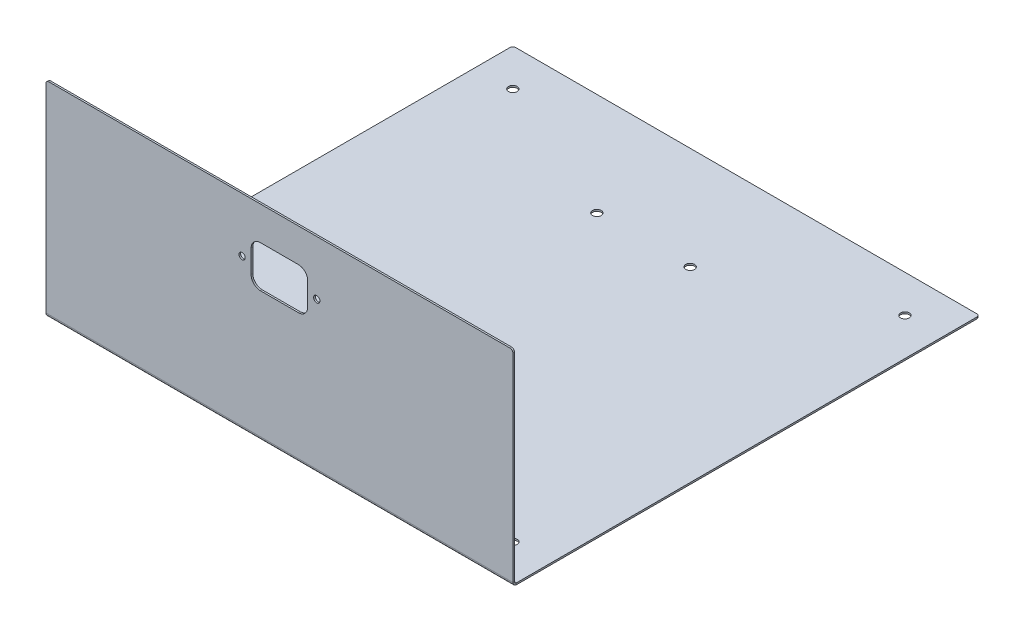
ISO-10303-21;
HEADER;
FILE_DESCRIPTION(('STEP AP214'),'2;1');
FILE_NAME('part.step','',(''),(''),'','','');
FILE_SCHEMA(('AUTOMOTIVE_DESIGN { 1 0 10303 214 1 1 1 1 }'));
ENDSEC;
DATA;
#1=APPLICATION_CONTEXT('core data for automotive mechanical design processes');
#2=APPLICATION_PROTOCOL_DEFINITION('international standard','automotive_design',2000,#1);
#3=PRODUCT_CONTEXT('',#1,'mechanical');
#4=PRODUCT('Part','Part','',(#3));
#5=PRODUCT_RELATED_PRODUCT_CATEGORY('part','',(#4));
#6=PRODUCT_DEFINITION_FORMATION('','',#4);
#7=PRODUCT_DEFINITION_CONTEXT('part definition',#1,'design');
#8=PRODUCT_DEFINITION('design','',#6,#7);
#9=PRODUCT_DEFINITION_SHAPE('','',#8);
#10=(LENGTH_UNIT() NAMED_UNIT(*) SI_UNIT(.MILLI.,.METRE.));
#11=(NAMED_UNIT(*) PLANE_ANGLE_UNIT() SI_UNIT($,.RADIAN.));
#12=(NAMED_UNIT(*) SI_UNIT($,.STERADIAN.) SOLID_ANGLE_UNIT());
#13=UNCERTAINTY_MEASURE_WITH_UNIT(LENGTH_MEASURE(1.E-05),#10,'distance_accuracy_value','');
#14=(GEOMETRIC_REPRESENTATION_CONTEXT(3) GLOBAL_UNCERTAINTY_ASSIGNED_CONTEXT((#13)) GLOBAL_UNIT_ASSIGNED_CONTEXT((#10,
#11,#12)) REPRESENTATION_CONTEXT('',''));
#15=CARTESIAN_POINT('',(0.,0.,0.));
#16=DIRECTION('',(0.,0.,1.));
#17=DIRECTION('',(1.,0.,0.));
#18=AXIS2_PLACEMENT_3D('',#15,#16,#17);
#19=CARTESIAN_POINT('',(125.,109.086699214334,70.8836992143335));
#20=DIRECTION('',(1.,0.,0.));
#21=DIRECTION('',(0.,-1.,0.));
#22=AXIS2_PLACEMENT_3D('',#19,#20,#21);
#23=PLANE('',#22);
#24=DIRECTION('',(0.,-1.,0.));
#25=VECTOR('',#24,1.);
#26=CARTESIAN_POINT('',(125.,109.086699214334,69.9736992143335));
#27=LINE('',#26,#25);
#28=CARTESIAN_POINT('',(125.,107.586699214334,69.9736992143335));
#29=VERTEX_POINT('',#28);
#30=CARTESIAN_POINT('',(125.,1.14300000000001,69.9736992143339));
#31=VERTEX_POINT('',#30);
#32=EDGE_CURVE('E236',#29,#31,#27,.T.);
#33=ORIENTED_EDGE('',*,*,#32,.F.);
#34=DIRECTION('',(0.,0.,-1.));
#35=VECTOR('',#34,1.);
#36=CARTESIAN_POINT('',(125.,107.586699214334,70.8836992143335));
#37=LINE('',#36,#35);
#38=CARTESIAN_POINT('',(125.,107.586699214334,70.8836992143335));
#39=VERTEX_POINT('',#38);
#40=EDGE_CURVE('E271',#29,#39,#37,.F.);
#41=ORIENTED_EDGE('',*,*,#40,.T.);
#42=DIRECTION('',(0.,-1.,0.));
#43=VECTOR('',#42,1.);
#44=CARTESIAN_POINT('',(125.,109.086699214334,70.8836992143335));
#45=LINE('',#44,#43);
#46=CARTESIAN_POINT('',(125.,1.14300000000001,70.8836992143339));
#47=VERTEX_POINT('',#46);
#48=EDGE_CURVE('E217',#39,#47,#45,.T.);
#49=ORIENTED_EDGE('',*,*,#48,.T.);
#50=DIRECTION('',(0.,0.,-1.));
#51=VECTOR('',#50,1.);
#52=CARTESIAN_POINT('',(125.,1.14300000000001,70.8836992143339));
#53=LINE('',#52,#51);
#54=EDGE_CURVE('E227',#47,#31,#53,.T.);
#55=ORIENTED_EDGE('',*,*,#54,.T.);
#56=EDGE_LOOP('',(#33,#41,#49,#55));
#57=FACE_BOUND('',#56,.T.);
#58=ADVANCED_FACE('F45',(#57),#23,.T.);
#59=CARTESIAN_POINT('',(-125.,109.086699214334,70.8836992143335));
#60=DIRECTION('',(-1.,0.,0.));
#61=DIRECTION('',(0.,1.,0.));
#62=AXIS2_PLACEMENT_3D('',#59,#60,#61);
#63=PLANE('',#62);
#64=DIRECTION('',(0.,1.,0.));
#65=VECTOR('',#64,1.);
#66=CARTESIAN_POINT('',(-125.,109.086699214334,70.8836992143335));
#67=LINE('',#66,#65);
#68=CARTESIAN_POINT('',(-125.,1.14300000000002,70.8836992143338));
#69=VERTEX_POINT('',#68);
#70=CARTESIAN_POINT('',(-125.,107.586699214334,70.8836992143335));
#71=VERTEX_POINT('',#70);
#72=EDGE_CURVE('E209',#69,#71,#67,.T.);
#73=ORIENTED_EDGE('',*,*,#72,.T.);
#74=DIRECTION('',(0.,0.,-1.));
#75=VECTOR('',#74,1.);
#76=CARTESIAN_POINT('',(-125.,107.586699214334,70.8836992143335));
#77=LINE('',#76,#75);
#78=CARTESIAN_POINT('',(-125.,107.586699214334,69.9736992143335));
#79=VERTEX_POINT('',#78);
#80=EDGE_CURVE('E257',#71,#79,#77,.T.);
#81=ORIENTED_EDGE('',*,*,#80,.T.);
#82=DIRECTION('',(0.,1.,0.));
#83=VECTOR('',#82,1.);
#84=CARTESIAN_POINT('',(-125.,109.086699214334,69.9736992143335));
#85=LINE('',#84,#83);
#86=CARTESIAN_POINT('',(-125.,1.14300000000001,69.9736992143339));
#87=VERTEX_POINT('',#86);
#88=EDGE_CURVE('E222',#87,#79,#85,.T.);
#89=ORIENTED_EDGE('',*,*,#88,.F.);
#90=DIRECTION('',(0.,0.,1.));
#91=VECTOR('',#90,1.);
#92=CARTESIAN_POINT('',(-125.,1.14300000000001,70.8836992143339));
#93=LINE('',#92,#91);
#94=EDGE_CURVE('E195',#87,#69,#93,.T.);
#95=ORIENTED_EDGE('',*,*,#94,.T.);
#96=EDGE_LOOP('',(#73,#81,#89,#95));
#97=FACE_BOUND('',#96,.T.);
#98=ADVANCED_FACE('F220',(#97),#63,.T.);
#99=CARTESIAN_POINT('',(0.,-70.0263007856661,70.8836992143341));
#100=DIRECTION('',(0.,0.,1.));
#101=DIRECTION('',(0.,-1.,0.));
#102=AXIS2_PLACEMENT_3D('',#99,#100,#101);
#103=PLANE('',#102);
#104=CARTESIAN_POINT('',(20.,80.,70.8836992143339));
#105=DIRECTION('',(0.,0.,1.));
#106=DIRECTION('',(1.,0.,0.));
#107=AXIS2_PLACEMENT_3D('',#104,#105,#106);
#108=CIRCLE('',#107,1.7);
#109=CARTESIAN_POINT('',(21.7,80.,70.8836992143339));
#110=VERTEX_POINT('',#109);
#111=EDGE_CURVE('E541',#110,#110,#108,.T.);
#112=ORIENTED_EDGE('',*,*,#111,.F.);
#113=EDGE_LOOP('',(#112));
#114=FACE_BOUND('',#113,.T.);
#115=CARTESIAN_POINT('',(-20.,80.,70.8836992143339));
#116=DIRECTION('',(0.,0.,1.));
#117=DIRECTION('',(1.,0.,0.));
#118=AXIS2_PLACEMENT_3D('',#115,#116,#117);
#119=CIRCLE('',#118,1.7);
#120=CARTESIAN_POINT('',(-18.3,80.,70.8836992143339));
#121=VERTEX_POINT('',#120);
#122=EDGE_CURVE('E362',#121,#121,#119,.T.);
#123=ORIENTED_EDGE('',*,*,#122,.F.);
#124=EDGE_LOOP('',(#123));
#125=FACE_BOUND('',#124,.T.);
#126=DIRECTION('',(0.,1.,0.));
#127=VECTOR('',#126,1.);
#128=CARTESIAN_POINT('',(15.15,68.85,70.8836992143339));
#129=LINE('',#128,#127);
#130=CARTESIAN_POINT('',(15.15,73.85,70.8836992143339));
#131=VERTEX_POINT('',#130);
#132=CARTESIAN_POINT('',(15.15,86.15,70.8836992143339));
#133=VERTEX_POINT('',#132);
#134=EDGE_CURVE('E349',#131,#133,#129,.T.);
#135=ORIENTED_EDGE('',*,*,#134,.F.);
#136=CARTESIAN_POINT('',(10.15,73.85,70.8836992143336));
#137=DIRECTION('',(0.,0.,1.));
#138=DIRECTION('',(0.,-1.,0.));
#139=AXIS2_PLACEMENT_3D('',#136,#137,#138);
#140=CIRCLE('',#139,5.);
#141=CARTESIAN_POINT('',(10.15,68.85,70.8836992143339));
#142=VERTEX_POINT('',#141);
#143=EDGE_CURVE('E310',#131,#142,#140,.F.);
#144=ORIENTED_EDGE('',*,*,#143,.T.);
#145=DIRECTION('',(1.,0.,0.));
#146=VECTOR('',#145,1.);
#147=CARTESIAN_POINT('',(-15.15,68.85,70.8836992143339));
#148=LINE('',#147,#146);
#149=CARTESIAN_POINT('',(-10.15,68.85,70.8836992143339));
#150=VERTEX_POINT('',#149);
#151=EDGE_CURVE('E288',#150,#142,#148,.T.);
#152=ORIENTED_EDGE('',*,*,#151,.F.);
#153=CARTESIAN_POINT('',(-10.15,73.85,70.8836992143336));
#154=DIRECTION('',(0.,0.,1.));
#155=DIRECTION('',(0.,-1.,0.));
#156=AXIS2_PLACEMENT_3D('',#153,#154,#155);
#157=CIRCLE('',#156,5.);
#158=CARTESIAN_POINT('',(-15.15,73.85,70.8836992143339));
#159=VERTEX_POINT('',#158);
#160=EDGE_CURVE('E53',#150,#159,#157,.F.);
#161=ORIENTED_EDGE('',*,*,#160,.T.);
#162=DIRECTION('',(0.,-1.,0.));
#163=VECTOR('',#162,1.);
#164=CARTESIAN_POINT('',(-15.15,68.85,70.8836992143339));
#165=LINE('',#164,#163);
#166=CARTESIAN_POINT('',(-15.15,86.15,70.8836992143339));
#167=VERTEX_POINT('',#166);
#168=EDGE_CURVE('E324',#167,#159,#165,.T.);
#169=ORIENTED_EDGE('',*,*,#168,.F.);
#170=CARTESIAN_POINT('',(-10.15,86.15,70.8836992143336));
#171=DIRECTION('',(0.,0.,1.));
#172=DIRECTION('',(0.,-1.,0.));
#173=AXIS2_PLACEMENT_3D('',#170,#171,#172);
#174=CIRCLE('',#173,5.);
#175=CARTESIAN_POINT('',(-10.15,91.15,70.8836992143339));
#176=VERTEX_POINT('',#175);
#177=EDGE_CURVE('E318',#167,#176,#174,.F.);
#178=ORIENTED_EDGE('',*,*,#177,.T.);
#179=DIRECTION('',(-1.,0.,0.));
#180=VECTOR('',#179,1.);
#181=CARTESIAN_POINT('',(-15.15,91.15,70.8836992143339));
#182=LINE('',#181,#180);
#183=CARTESIAN_POINT('',(10.15,91.15,70.8836992143339));
#184=VERTEX_POINT('',#183);
#185=EDGE_CURVE('E330',#184,#176,#182,.T.);
#186=ORIENTED_EDGE('',*,*,#185,.F.);
#187=CARTESIAN_POINT('',(10.15,86.15,70.8836992143336));
#188=DIRECTION('',(0.,0.,1.));
#189=DIRECTION('',(0.,-1.,0.));
#190=AXIS2_PLACEMENT_3D('',#187,#188,#189);
#191=CIRCLE('',#190,5.);
#192=EDGE_CURVE('E314',#184,#133,#191,.F.);
#193=ORIENTED_EDGE('',*,*,#192,.T.);
#194=EDGE_LOOP('',(#135,#144,#152,#161,#169,#178,#186,#193));
#195=FACE_BOUND('',#194,.T.);
#196=DIRECTION('',(1.,0.,0.));
#197=VECTOR('',#196,1.);
#198=CARTESIAN_POINT('',(-125.,109.086699214334,70.8836992143335));
#199=LINE('',#198,#197);
#200=CARTESIAN_POINT('',(-123.5,109.086699214334,70.8836992143335));
#201=VERTEX_POINT('',#200);
#202=CARTESIAN_POINT('',(123.5,109.086699214334,70.8836992143335));
#203=VERTEX_POINT('',#202);
#204=EDGE_CURVE('E196',#201,#203,#199,.T.);
#205=ORIENTED_EDGE('',*,*,#204,.F.);
#206=CARTESIAN_POINT('',(-123.5,107.586699214334,70.8836992143335));
#207=DIRECTION('',(0.,0.,1.));
#208=DIRECTION('',(0.,-1.,0.));
#209=AXIS2_PLACEMENT_3D('',#206,#207,#208);
#210=CIRCLE('',#209,1.5);
#211=EDGE_CURVE('E213',#201,#71,#210,.T.);
#212=ORIENTED_EDGE('',*,*,#211,.T.);
#213=ORIENTED_EDGE('',*,*,#72,.F.);
#214=DIRECTION('',(1.,0.,0.));
#215=VECTOR('',#214,1.);
#216=CARTESIAN_POINT('',(0.,1.14300000000001,70.8836992143339));
#217=LINE('',#216,#215);
#218=EDGE_CURVE('E184',#69,#47,#217,.T.);
#219=ORIENTED_EDGE('',*,*,#218,.T.);
#220=ORIENTED_EDGE('',*,*,#48,.F.);
#221=CARTESIAN_POINT('',(123.5,107.586699214334,70.8836992143335));
#222=DIRECTION('',(0.,0.,1.));
#223=DIRECTION('',(0.,-1.,0.));
#224=AXIS2_PLACEMENT_3D('',#221,#222,#223);
#225=CIRCLE('',#224,1.5);
#226=EDGE_CURVE('E268',#39,#203,#225,.T.);
#227=ORIENTED_EDGE('',*,*,#226,.T.);
#228=EDGE_LOOP('',(#205,#212,#213,#219,#220,#227));
#229=FACE_BOUND('',#228,.T.);
#230=ADVANCED_FACE('F211',(#114,#125,#195,#229),#103,.T.);
#231=CARTESIAN_POINT('',(-125.,109.086699214334,70.8836992143335));
#232=DIRECTION('',(0.,1.,0.));
#233=DIRECTION('',(1.,0.,0.));
#234=AXIS2_PLACEMENT_3D('',#231,#232,#233);
#235=PLANE('',#234);
#236=DIRECTION('',(1.,0.,0.));
#237=VECTOR('',#236,1.);
#238=CARTESIAN_POINT('',(-125.,109.086699214334,69.9736992143335));
#239=LINE('',#238,#237);
#240=CARTESIAN_POINT('',(-123.5,109.086699214334,69.9736992143335));
#241=VERTEX_POINT('',#240);
#242=CARTESIAN_POINT('',(123.5,109.086699214334,69.9736992143335));
#243=VERTEX_POINT('',#242);
#244=EDGE_CURVE('E235',#241,#243,#239,.T.);
#245=ORIENTED_EDGE('',*,*,#244,.F.);
#246=DIRECTION('',(0.,0.,-1.));
#247=VECTOR('',#246,1.);
#248=CARTESIAN_POINT('',(-123.5,109.086699214334,70.8836992143335));
#249=LINE('',#248,#247);
#250=EDGE_CURVE('E266',#241,#201,#249,.F.);
#251=ORIENTED_EDGE('',*,*,#250,.T.);
#252=ORIENTED_EDGE('',*,*,#204,.T.);
#253=DIRECTION('',(0.,0.,-1.));
#254=VECTOR('',#253,1.);
#255=CARTESIAN_POINT('',(123.5,109.086699214334,70.8836992143335));
#256=LINE('',#255,#254);
#257=EDGE_CURVE('E263',#203,#243,#256,.T.);
#258=ORIENTED_EDGE('',*,*,#257,.T.);
#259=EDGE_LOOP('',(#245,#251,#252,#258));
#260=FACE_BOUND('',#259,.T.);
#261=ADVANCED_FACE('F449',(#260),#235,.T.);
#262=CARTESIAN_POINT('',(0.,-70.0263007856661,69.9736992143341));
#263=DIRECTION('',(0.,0.,1.));
#264=DIRECTION('',(0.,-1.,0.));
#265=AXIS2_PLACEMENT_3D('',#262,#263,#264);
#266=PLANE('',#265);
#267=CARTESIAN_POINT('',(20.,80.,69.9736992143336));
#268=DIRECTION('',(0.,0.,1.));
#269=DIRECTION('',(0.,-1.,0.));
#270=AXIS2_PLACEMENT_3D('',#267,#268,#269);
#271=CIRCLE('',#270,1.7);
#272=CARTESIAN_POINT('',(20.,78.3,69.9736992143336));
#273=VERTEX_POINT('',#272);
#274=EDGE_CURVE('E287',#273,#273,#271,.T.);
#275=ORIENTED_EDGE('',*,*,#274,.T.);
#276=EDGE_LOOP('',(#275));
#277=FACE_BOUND('',#276,.T.);
#278=CARTESIAN_POINT('',(-20.,80.,69.9736992143336));
#279=DIRECTION('',(0.,0.,1.));
#280=DIRECTION('',(0.,-1.,0.));
#281=AXIS2_PLACEMENT_3D('',#278,#279,#280);
#282=CIRCLE('',#281,1.7);
#283=CARTESIAN_POINT('',(-20.,78.3,69.9736992143336));
#284=VERTEX_POINT('',#283);
#285=EDGE_CURVE('E284',#284,#284,#282,.T.);
#286=ORIENTED_EDGE('',*,*,#285,.T.);
#287=EDGE_LOOP('',(#286));
#288=FACE_BOUND('',#287,.T.);
#289=DIRECTION('',(0.,-1.,0.));
#290=VECTOR('',#289,1.);
#291=CARTESIAN_POINT('',(-15.15,-70.0263007856661,69.9736992143341));
#292=LINE('',#291,#290);
#293=CARTESIAN_POINT('',(-15.15,86.15,69.9736992143336));
#294=VERTEX_POINT('',#293);
#295=CARTESIAN_POINT('',(-15.15,73.85,69.9736992143336));
#296=VERTEX_POINT('',#295);
#297=EDGE_CURVE('E275',#294,#296,#292,.T.);
#298=ORIENTED_EDGE('',*,*,#297,.T.);
#299=CARTESIAN_POINT('',(-10.15,73.85,69.9736992143336));
#300=DIRECTION('',(0.,0.,1.));
#301=DIRECTION('',(0.,-1.,0.));
#302=AXIS2_PLACEMENT_3D('',#299,#300,#301);
#303=CIRCLE('',#302,5.);
#304=CARTESIAN_POINT('',(-10.15,68.85,69.9736992143336));
#305=VERTEX_POINT('',#304);
#306=EDGE_CURVE('E12',#296,#305,#303,.T.);
#307=ORIENTED_EDGE('',*,*,#306,.T.);
#308=DIRECTION('',(1.,0.,0.));
#309=VECTOR('',#308,1.);
#310=CARTESIAN_POINT('',(0.,68.85,69.9736992143336));
#311=LINE('',#310,#309);
#312=CARTESIAN_POINT('',(10.15,68.85,69.9736992143336));
#313=VERTEX_POINT('',#312);
#314=EDGE_CURVE('E277',#305,#313,#311,.T.);
#315=ORIENTED_EDGE('',*,*,#314,.T.);
#316=CARTESIAN_POINT('',(10.15,73.85,69.9736992143336));
#317=DIRECTION('',(0.,0.,1.));
#318=DIRECTION('',(0.,-1.,0.));
#319=AXIS2_PLACEMENT_3D('',#316,#317,#318);
#320=CIRCLE('',#319,5.);
#321=CARTESIAN_POINT('',(15.15,73.85,69.9736992143336));
#322=VERTEX_POINT('',#321);
#323=EDGE_CURVE('E312',#313,#322,#320,.T.);
#324=ORIENTED_EDGE('',*,*,#323,.T.);
#325=DIRECTION('',(0.,1.,0.));
#326=VECTOR('',#325,1.);
#327=CARTESIAN_POINT('',(15.15,-70.0263007856661,69.9736992143341));
#328=LINE('',#327,#326);
#329=CARTESIAN_POINT('',(15.15,86.15,69.9736992143336));
#330=VERTEX_POINT('',#329);
#331=EDGE_CURVE('E280',#322,#330,#328,.T.);
#332=ORIENTED_EDGE('',*,*,#331,.T.);
#333=CARTESIAN_POINT('',(10.15,86.15,69.9736992143336));
#334=DIRECTION('',(0.,0.,1.));
#335=DIRECTION('',(0.,-1.,0.));
#336=AXIS2_PLACEMENT_3D('',#333,#334,#335);
#337=CIRCLE('',#336,5.);
#338=CARTESIAN_POINT('',(10.15,91.15,69.9736992143335));
#339=VERTEX_POINT('',#338);
#340=EDGE_CURVE('E316',#330,#339,#337,.T.);
#341=ORIENTED_EDGE('',*,*,#340,.T.);
#342=DIRECTION('',(-1.,0.,0.));
#343=VECTOR('',#342,1.);
#344=CARTESIAN_POINT('',(0.,91.15,69.9736992143335));
#345=LINE('',#344,#343);
#346=CARTESIAN_POINT('',(-10.15,91.15,69.9736992143335));
#347=VERTEX_POINT('',#346);
#348=EDGE_CURVE('E273',#339,#347,#345,.T.);
#349=ORIENTED_EDGE('',*,*,#348,.T.);
#350=CARTESIAN_POINT('',(-10.15,86.15,69.9736992143336));
#351=DIRECTION('',(0.,0.,1.));
#352=DIRECTION('',(0.,-1.,0.));
#353=AXIS2_PLACEMENT_3D('',#350,#351,#352);
#354=CIRCLE('',#353,5.);
#355=EDGE_CURVE('E67',#347,#294,#354,.T.);
#356=ORIENTED_EDGE('',*,*,#355,.T.);
#357=EDGE_LOOP('',(#298,#307,#315,#324,#332,#341,#349,#356));
#358=FACE_BOUND('',#357,.T.);
#359=ORIENTED_EDGE('',*,*,#88,.T.);
#360=CARTESIAN_POINT('',(-123.5,107.586699214334,69.9736992143335));
#361=DIRECTION('',(0.,0.,1.));
#362=DIRECTION('',(0.,-1.,0.));
#363=AXIS2_PLACEMENT_3D('',#360,#361,#362);
#364=CIRCLE('',#363,1.5);
#365=EDGE_CURVE('E261',#79,#241,#364,.F.);
#366=ORIENTED_EDGE('',*,*,#365,.T.);
#367=ORIENTED_EDGE('',*,*,#244,.T.);
#368=CARTESIAN_POINT('',(123.5,107.586699214334,69.9736992143335));
#369=DIRECTION('',(0.,0.,1.));
#370=DIRECTION('',(0.,-1.,0.));
#371=AXIS2_PLACEMENT_3D('',#368,#369,#370);
#372=CIRCLE('',#371,1.5);
#373=EDGE_CURVE('E259',#243,#29,#372,.F.);
#374=ORIENTED_EDGE('',*,*,#373,.T.);
#375=ORIENTED_EDGE('',*,*,#32,.T.);
#376=DIRECTION('',(1.,0.,0.));
#377=VECTOR('',#376,1.);
#378=CARTESIAN_POINT('',(0.,1.14300000000001,69.9736992143339));
#379=LINE('',#378,#377);
#380=EDGE_CURVE('E224',#87,#31,#379,.T.);
#381=ORIENTED_EDGE('',*,*,#380,.F.);
#382=EDGE_LOOP('',(#359,#366,#367,#374,#375,#381));
#383=FACE_BOUND('',#382,.T.);
#384=ADVANCED_FACE('F334',(#277,#288,#358,#383),#266,.F.);
#385=CARTESIAN_POINT('',(-125.,-0.91,-179.113));
#386=DIRECTION('',(0.,0.,-1.));
#387=DIRECTION('',(-1.,0.,0.));
#388=AXIS2_PLACEMENT_3D('',#385,#386,#387);
#389=PLANE('',#388);
#390=DIRECTION('',(-1.,0.,0.));
#391=VECTOR('',#390,1.);
#392=CARTESIAN_POINT('',(-125.,0.,-179.113));
#393=LINE('',#392,#391);
#394=CARTESIAN_POINT('',(123.5,0.,-179.113));
#395=VERTEX_POINT('',#394);
#396=CARTESIAN_POINT('',(-123.5,0.,-179.113));
#397=VERTEX_POINT('',#396);
#398=EDGE_CURVE('E422',#395,#397,#393,.T.);
#399=ORIENTED_EDGE('',*,*,#398,.F.);
#400=DIRECTION('',(0.,1.,0.));
#401=VECTOR('',#400,1.);
#402=CARTESIAN_POINT('',(123.5,-0.91,-179.113));
#403=LINE('',#402,#401);
#404=CARTESIAN_POINT('',(123.5,-0.91,-179.113));
#405=VERTEX_POINT('',#404);
#406=EDGE_CURVE('E249',#395,#405,#403,.F.);
#407=ORIENTED_EDGE('',*,*,#406,.T.);
#408=DIRECTION('',(-1.,0.,0.));
#409=VECTOR('',#408,1.);
#410=CARTESIAN_POINT('',(-125.,-0.91,-179.113));
#411=LINE('',#410,#409);
#412=CARTESIAN_POINT('',(-123.5,-0.91,-179.113));
#413=VERTEX_POINT('',#412);
#414=EDGE_CURVE('E435',#405,#413,#411,.T.);
#415=ORIENTED_EDGE('',*,*,#414,.T.);
#416=DIRECTION('',(0.,1.,0.));
#417=VECTOR('',#416,1.);
#418=CARTESIAN_POINT('',(-123.5,-0.91,-179.113));
#419=LINE('',#418,#417);
#420=EDGE_CURVE('E246',#413,#397,#419,.T.);
#421=ORIENTED_EDGE('',*,*,#420,.T.);
#422=EDGE_LOOP('',(#399,#407,#415,#421));
#423=FACE_BOUND('',#422,.T.);
#424=ADVANCED_FACE('F506',(#423),#389,.T.);
#425=CARTESIAN_POINT('',(0.,-0.91,0.));
#426=DIRECTION('',(0.,-1.,0.));
#427=DIRECTION('',(0.,0.,-1.));
#428=AXIS2_PLACEMENT_3D('',#425,#426,#427);
#429=PLANE('',#428);
#430=CARTESIAN_POINT('',(25.,-0.909999999999999,25.887));
#431=DIRECTION('',(0.,-1.,0.));
#432=DIRECTION('',(0.,0.,-1.));
#433=AXIS2_PLACEMENT_3D('',#430,#431,#432);
#434=CIRCLE('',#433,2.35);
#435=CARTESIAN_POINT('',(25.,-0.909999999999999,23.537));
#436=VERTEX_POINT('',#435);
#437=EDGE_CURVE('E387',#436,#436,#434,.T.);
#438=ORIENTED_EDGE('',*,*,#437,.F.);
#439=EDGE_LOOP('',(#438));
#440=FACE_BOUND('',#439,.T.);
#441=CARTESIAN_POINT('',(-25.,-0.909999999999999,25.887));
#442=DIRECTION('',(0.,-1.,0.));
#443=DIRECTION('',(0.,0.,-1.));
#444=AXIS2_PLACEMENT_3D('',#441,#442,#443);
#445=CIRCLE('',#444,2.35);
#446=CARTESIAN_POINT('',(-25.,-0.909999999999999,23.537));
#447=VERTEX_POINT('',#446);
#448=EDGE_CURVE('E384',#447,#447,#445,.T.);
#449=ORIENTED_EDGE('',*,*,#448,.F.);
#450=EDGE_LOOP('',(#449));
#451=FACE_BOUND('',#450,.T.);
#452=CARTESIAN_POINT('',(-25.,-0.909999999999999,-124.113));
#453=DIRECTION('',(0.,-1.,0.));
#454=DIRECTION('',(0.,0.,-1.));
#455=AXIS2_PLACEMENT_3D('',#452,#453,#454);
#456=CIRCLE('',#455,2.34999999999999);
#457=CARTESIAN_POINT('',(-25.,-0.909999999999999,-126.463));
#458=VERTEX_POINT('',#457);
#459=EDGE_CURVE('E381',#458,#458,#456,.T.);
#460=ORIENTED_EDGE('',*,*,#459,.F.);
#461=EDGE_LOOP('',(#460));
#462=FACE_BOUND('',#461,.T.);
#463=CARTESIAN_POINT('',(25.,-0.909999999999999,-124.113));
#464=DIRECTION('',(0.,-1.,0.));
#465=DIRECTION('',(0.,0.,-1.));
#466=AXIS2_PLACEMENT_3D('',#463,#464,#465);
#467=CIRCLE('',#466,2.34999999999999);
#468=CARTESIAN_POINT('',(25.,-0.909999999999999,-126.463));
#469=VERTEX_POINT('',#468);
#470=EDGE_CURVE('E378',#469,#469,#467,.T.);
#471=ORIENTED_EDGE('',*,*,#470,.F.);
#472=EDGE_LOOP('',(#471));
#473=FACE_BOUND('',#472,.T.);
#474=CARTESIAN_POINT('',(-105.,-0.91,50.8836992143335));
#475=DIRECTION('',(0.,1.,0.));
#476=DIRECTION('',(0.,0.,1.));
#477=AXIS2_PLACEMENT_3D('',#474,#475,#476);
#478=CIRCLE('',#477,2.35);
#479=CARTESIAN_POINT('',(-105.,-0.91,53.2336992143335));
#480=VERTEX_POINT('',#479);
#481=EDGE_CURVE('E390',#480,#480,#478,.T.);
#482=ORIENTED_EDGE('',*,*,#481,.T.);
#483=EDGE_LOOP('',(#482));
#484=FACE_BOUND('',#483,.T.);
#485=CARTESIAN_POINT('',(105.,-0.91,50.8836992143335));
#486=DIRECTION('',(0.,1.,0.));
#487=DIRECTION('',(0.,0.,1.));
#488=AXIS2_PLACEMENT_3D('',#485,#486,#487);
#489=CIRCLE('',#488,2.35);
#490=CARTESIAN_POINT('',(105.,-0.91,53.2336992143335));
#491=VERTEX_POINT('',#490);
#492=EDGE_CURVE('E401',#491,#491,#489,.T.);
#493=ORIENTED_EDGE('',*,*,#492,.T.);
#494=EDGE_LOOP('',(#493));
#495=FACE_BOUND('',#494,.T.);
#496=CARTESIAN_POINT('',(105.,-0.91,-159.113));
#497=DIRECTION('',(0.,1.,0.));
#498=DIRECTION('',(0.,0.,1.));
#499=AXIS2_PLACEMENT_3D('',#496,#497,#498);
#500=CIRCLE('',#499,2.35);
#501=CARTESIAN_POINT('',(105.,-0.91,-156.763));
#502=VERTEX_POINT('',#501);
#503=EDGE_CURVE('E395',#502,#502,#500,.T.);
#504=ORIENTED_EDGE('',*,*,#503,.T.);
#505=EDGE_LOOP('',(#504));
#506=FACE_BOUND('',#505,.T.);
#507=CARTESIAN_POINT('',(-105.,-0.91,-159.113));
#508=DIRECTION('',(0.,1.,0.));
#509=DIRECTION('',(0.,0.,1.));
#510=AXIS2_PLACEMENT_3D('',#507,#508,#509);
#511=CIRCLE('',#510,2.35);
#512=CARTESIAN_POINT('',(-105.,-0.91,-156.763));
#513=VERTEX_POINT('',#512);
#514=EDGE_CURVE('E409',#513,#513,#511,.T.);
#515=ORIENTED_EDGE('',*,*,#514,.T.);
#516=EDGE_LOOP('',(#515));
#517=FACE_BOUND('',#516,.T.);
#518=ORIENTED_EDGE('',*,*,#414,.F.);
#519=CARTESIAN_POINT('',(123.5,-0.91,-177.613));
#520=DIRECTION('',(0.,-1.,0.));
#521=DIRECTION('',(0.,0.,-1.));
#522=AXIS2_PLACEMENT_3D('',#519,#520,#521);
#523=CIRCLE('',#522,1.5);
#524=CARTESIAN_POINT('',(125.,-0.91,-177.613));
#525=VERTEX_POINT('',#524);
#526=EDGE_CURVE('E253',#405,#525,#523,.T.);
#527=ORIENTED_EDGE('',*,*,#526,.T.);
#528=DIRECTION('',(0.,0.,-1.));
#529=VECTOR('',#528,1.);
#530=CARTESIAN_POINT('',(125.,-0.91,179.113));
#531=LINE('',#530,#529);
#532=CARTESIAN_POINT('',(125.,-0.91,68.8306992143338));
#533=VERTEX_POINT('',#532);
#534=EDGE_CURVE('E238',#533,#525,#531,.T.);
#535=ORIENTED_EDGE('',*,*,#534,.F.);
#536=DIRECTION('',(1.,0.,0.));
#537=VECTOR('',#536,1.);
#538=CARTESIAN_POINT('',(0.,-0.91,68.8306992143339));
#539=LINE('',#538,#537);
#540=CARTESIAN_POINT('',(-125.,-0.909999999999993,68.8306992143338));
#541=VERTEX_POINT('',#540);
#542=EDGE_CURVE('E416',#541,#533,#539,.T.);
#543=ORIENTED_EDGE('',*,*,#542,.F.);
#544=DIRECTION('',(0.,0.,1.));
#545=VECTOR('',#544,1.);
#546=CARTESIAN_POINT('',(-125.,-0.91,179.113));
#547=LINE('',#546,#545);
#548=CARTESIAN_POINT('',(-125.,-0.91,-177.613));
#549=VERTEX_POINT('',#548);
#550=EDGE_CURVE('E433',#549,#541,#547,.T.);
#551=ORIENTED_EDGE('',*,*,#550,.F.);
#552=CARTESIAN_POINT('',(-123.5,-0.91,-177.613));
#553=DIRECTION('',(0.,-1.,0.));
#554=DIRECTION('',(0.,0.,-1.));
#555=AXIS2_PLACEMENT_3D('',#552,#553,#554);
#556=CIRCLE('',#555,1.5);
#557=EDGE_CURVE('E251',#549,#413,#556,.T.);
#558=ORIENTED_EDGE('',*,*,#557,.T.);
#559=EDGE_LOOP('',(#518,#527,#535,#543,#551,#558));
#560=FACE_BOUND('',#559,.T.);
#561=ADVANCED_FACE('F501',(#440,#451,#462,#473,#484,#495,#506,#517,#560),#429,.T.);
#562=CARTESIAN_POINT('',(-125.,-0.91,179.113));
#563=DIRECTION('',(-1.,0.,0.));
#564=DIRECTION('',(0.,0.,1.));
#565=AXIS2_PLACEMENT_3D('',#562,#563,#564);
#566=PLANE('',#565);
#567=DIRECTION('',(0.,0.,1.));
#568=VECTOR('',#567,1.);
#569=CARTESIAN_POINT('',(-125.,0.,179.113));
#570=LINE('',#569,#568);
#571=CARTESIAN_POINT('',(-125.,0.,-177.613));
#572=VERTEX_POINT('',#571);
#573=CARTESIAN_POINT('',(-125.,0.,68.8306992143338));
#574=VERTEX_POINT('',#573);
#575=EDGE_CURVE('E431',#572,#574,#570,.T.);
#576=ORIENTED_EDGE('',*,*,#575,.F.);
#577=DIRECTION('',(0.,1.,0.));
#578=VECTOR('',#577,1.);
#579=CARTESIAN_POINT('',(-125.,-0.91,-177.613));
#580=LINE('',#579,#578);
#581=EDGE_CURVE('E255',#572,#549,#580,.F.);
#582=ORIENTED_EDGE('',*,*,#581,.T.);
#583=ORIENTED_EDGE('',*,*,#550,.T.);
#584=DIRECTION('',(0.,-1.,0.));
#585=VECTOR('',#584,1.);
#586=CARTESIAN_POINT('',(-125.,-0.910000000000007,68.8306992143338));
#587=LINE('',#586,#585);
#588=EDGE_CURVE('E205',#574,#541,#587,.T.);
#589=ORIENTED_EDGE('',*,*,#588,.F.);
#590=EDGE_LOOP('',(#576,#582,#583,#589));
#591=FACE_BOUND('',#590,.T.);
#592=ADVANCED_FACE('F515',(#591),#566,.T.);
#593=CARTESIAN_POINT('',(0.,0.,0.));
#594=DIRECTION('',(0.,-1.,0.));
#595=DIRECTION('',(0.,0.,-1.));
#596=AXIS2_PLACEMENT_3D('',#593,#594,#595);
#597=PLANE('',#596);
#598=CARTESIAN_POINT('',(25.,0.,25.887));
#599=DIRECTION('',(0.,1.,0.));
#600=DIRECTION('',(0.,0.,1.));
#601=AXIS2_PLACEMENT_3D('',#598,#599,#600);
#602=CIRCLE('',#601,2.35);
#603=CARTESIAN_POINT('',(25.,0.,28.237));
#604=VERTEX_POINT('',#603);
#605=EDGE_CURVE('E291',#604,#604,#602,.T.);
#606=ORIENTED_EDGE('',*,*,#605,.F.);
#607=EDGE_LOOP('',(#606));
#608=FACE_BOUND('',#607,.T.);
#609=CARTESIAN_POINT('',(-25.,0.,25.887));
#610=DIRECTION('',(0.,1.,0.));
#611=DIRECTION('',(0.,0.,1.));
#612=AXIS2_PLACEMENT_3D('',#609,#610,#611);
#613=CIRCLE('',#612,2.35);
#614=CARTESIAN_POINT('',(-25.,0.,28.237));
#615=VERTEX_POINT('',#614);
#616=EDGE_CURVE('E371',#615,#615,#613,.T.);
#617=ORIENTED_EDGE('',*,*,#616,.F.);
#618=EDGE_LOOP('',(#617));
#619=FACE_BOUND('',#618,.T.);
#620=CARTESIAN_POINT('',(-25.,0.,-124.113));
#621=DIRECTION('',(0.,1.,0.));
#622=DIRECTION('',(0.,0.,1.));
#623=AXIS2_PLACEMENT_3D('',#620,#621,#622);
#624=CIRCLE('',#623,2.34999999999999);
#625=CARTESIAN_POINT('',(-25.,0.,-121.763));
#626=VERTEX_POINT('',#625);
#627=EDGE_CURVE('E367',#626,#626,#624,.T.);
#628=ORIENTED_EDGE('',*,*,#627,.F.);
#629=EDGE_LOOP('',(#628));
#630=FACE_BOUND('',#629,.T.);
#631=CARTESIAN_POINT('',(25.,0.,-124.113));
#632=DIRECTION('',(0.,1.,0.));
#633=DIRECTION('',(0.,0.,1.));
#634=AXIS2_PLACEMENT_3D('',#631,#632,#633);
#635=CIRCLE('',#634,2.34999999999999);
#636=CARTESIAN_POINT('',(25.,0.,-121.763));
#637=VERTEX_POINT('',#636);
#638=EDGE_CURVE('E370',#637,#637,#635,.T.);
#639=ORIENTED_EDGE('',*,*,#638,.F.);
#640=EDGE_LOOP('',(#639));
#641=FACE_BOUND('',#640,.T.);
#642=CARTESIAN_POINT('',(-105.,0.,50.8836992143335));
#643=DIRECTION('',(0.,1.,0.));
#644=DIRECTION('',(0.,0.,1.));
#645=AXIS2_PLACEMENT_3D('',#642,#643,#644);
#646=CIRCLE('',#645,2.35);
#647=CARTESIAN_POINT('',(-105.,0.,53.2336992143335));
#648=VERTEX_POINT('',#647);
#649=EDGE_CURVE('E404',#648,#648,#646,.T.);
#650=ORIENTED_EDGE('',*,*,#649,.F.);
#651=EDGE_LOOP('',(#650));
#652=FACE_BOUND('',#651,.T.);
#653=CARTESIAN_POINT('',(105.,0.,50.8836992143335));
#654=DIRECTION('',(0.,1.,0.));
#655=DIRECTION('',(0.,0.,1.));
#656=AXIS2_PLACEMENT_3D('',#653,#654,#655);
#657=CIRCLE('',#656,2.35);
#658=CARTESIAN_POINT('',(105.,0.,53.2336992143335));
#659=VERTEX_POINT('',#658);
#660=EDGE_CURVE('E398',#659,#659,#657,.T.);
#661=ORIENTED_EDGE('',*,*,#660,.F.);
#662=EDGE_LOOP('',(#661));
#663=FACE_BOUND('',#662,.T.);
#664=CARTESIAN_POINT('',(105.,0.,-159.113));
#665=DIRECTION('',(0.,1.,0.));
#666=DIRECTION('',(0.,0.,1.));
#667=AXIS2_PLACEMENT_3D('',#664,#665,#666);
#668=CIRCLE('',#667,2.35);
#669=CARTESIAN_POINT('',(105.,0.,-156.763));
#670=VERTEX_POINT('',#669);
#671=EDGE_CURVE('E391',#670,#670,#668,.T.);
#672=ORIENTED_EDGE('',*,*,#671,.F.);
#673=EDGE_LOOP('',(#672));
#674=FACE_BOUND('',#673,.T.);
#675=CARTESIAN_POINT('',(-105.,0.,-159.113));
#676=DIRECTION('',(0.,1.,0.));
#677=DIRECTION('',(0.,0.,1.));
#678=AXIS2_PLACEMENT_3D('',#675,#676,#677);
#679=CIRCLE('',#678,2.35);
#680=CARTESIAN_POINT('',(-105.,0.,-156.763));
#681=VERTEX_POINT('',#680);
#682=EDGE_CURVE('E394',#681,#681,#679,.T.);
#683=ORIENTED_EDGE('',*,*,#682,.F.);
#684=EDGE_LOOP('',(#683));
#685=FACE_BOUND('',#684,.T.);
#686=DIRECTION('',(0.,0.,-1.));
#687=VECTOR('',#686,1.);
#688=CARTESIAN_POINT('',(125.,0.,179.113));
#689=LINE('',#688,#687);
#690=CARTESIAN_POINT('',(125.,0.,68.8306992143338));
#691=VERTEX_POINT('',#690);
#692=CARTESIAN_POINT('',(125.,0.,-177.613));
#693=VERTEX_POINT('',#692);
#694=EDGE_CURVE('E425',#691,#693,#689,.T.);
#695=ORIENTED_EDGE('',*,*,#694,.T.);
#696=CARTESIAN_POINT('',(123.5,0.,-177.613));
#697=DIRECTION('',(0.,-1.,0.));
#698=DIRECTION('',(0.,0.,-1.));
#699=AXIS2_PLACEMENT_3D('',#696,#697,#698);
#700=CIRCLE('',#699,1.5);
#701=EDGE_CURVE('E244',#693,#395,#700,.F.);
#702=ORIENTED_EDGE('',*,*,#701,.T.);
#703=ORIENTED_EDGE('',*,*,#398,.T.);
#704=CARTESIAN_POINT('',(-123.5,0.,-177.613));
#705=DIRECTION('',(0.,-1.,0.));
#706=DIRECTION('',(0.,0.,-1.));
#707=AXIS2_PLACEMENT_3D('',#704,#705,#706);
#708=CIRCLE('',#707,1.5);
#709=EDGE_CURVE('E242',#397,#572,#708,.F.);
#710=ORIENTED_EDGE('',*,*,#709,.T.);
#711=ORIENTED_EDGE('',*,*,#575,.T.);
#712=DIRECTION('',(1.,0.,0.));
#713=VECTOR('',#712,1.);
#714=CARTESIAN_POINT('',(0.,0.,68.8306992143339));
#715=LINE('',#714,#713);
#716=EDGE_CURVE('E428',#574,#691,#715,.T.);
#717=ORIENTED_EDGE('',*,*,#716,.T.);
#718=EDGE_LOOP('',(#695,#702,#703,#710,#711,#717));
#719=FACE_BOUND('',#718,.T.);
#720=ADVANCED_FACE('F512',(#608,#619,#630,#641,#652,#663,#674,#685,#719),#597,.F.);
#721=CARTESIAN_POINT('',(125.,-0.91,179.113));
#722=DIRECTION('',(1.,0.,0.));
#723=DIRECTION('',(0.,0.,-1.));
#724=AXIS2_PLACEMENT_3D('',#721,#722,#723);
#725=PLANE('',#724);
#726=ORIENTED_EDGE('',*,*,#534,.T.);
#727=DIRECTION('',(0.,1.,0.));
#728=VECTOR('',#727,1.);
#729=CARTESIAN_POINT('',(125.,-0.91,-177.613));
#730=LINE('',#729,#728);
#731=EDGE_CURVE('E233',#525,#693,#730,.T.);
#732=ORIENTED_EDGE('',*,*,#731,.T.);
#733=ORIENTED_EDGE('',*,*,#694,.F.);
#734=DIRECTION('',(0.,1.,0.));
#735=VECTOR('',#734,1.);
#736=CARTESIAN_POINT('',(125.,-0.910000000000007,68.8306992143339));
#737=LINE('',#736,#735);
#738=EDGE_CURVE('E439',#533,#691,#737,.T.);
#739=ORIENTED_EDGE('',*,*,#738,.F.);
#740=EDGE_LOOP('',(#726,#732,#733,#739));
#741=FACE_BOUND('',#740,.T.);
#742=ADVANCED_FACE('F510',(#741),#725,.T.);
#743=CARTESIAN_POINT('',(-125.,1.143,68.8306992143339));
#744=DIRECTION('',(-1.,0.,0.));
#745=DIRECTION('',(0.,0.,1.));
#746=AXIS2_PLACEMENT_3D('',#743,#744,#745);
#747=PLANE('',#746);
#748=ORIENTED_EDGE('',*,*,#94,.F.);
#749=CARTESIAN_POINT('',(-125.,1.143,68.8306992143338));
#750=DIRECTION('',(-1.,0.,0.));
#751=DIRECTION('',(0.,0.,1.));
#752=AXIS2_PLACEMENT_3D('',#749,#750,#751);
#753=CIRCLE('',#752,1.143);
#754=EDGE_CURVE('E412',#87,#574,#753,.F.);
#755=ORIENTED_EDGE('',*,*,#754,.T.);
#756=ORIENTED_EDGE('',*,*,#588,.T.);
#757=CARTESIAN_POINT('',(-125.,1.143,68.8306992143339));
#758=DIRECTION('',(1.,0.,0.));
#759=DIRECTION('',(0.,0.,1.));
#760=AXIS2_PLACEMENT_3D('',#757,#758,#759);
#761=CIRCLE('',#760,2.05299999999999);
#762=EDGE_CURVE('E188',#69,#541,#761,.T.);
#763=ORIENTED_EDGE('',*,*,#762,.F.);
#764=EDGE_LOOP('',(#748,#755,#756,#763));
#765=FACE_BOUND('',#764,.T.);
#766=ADVANCED_FACE('F200',(#765),#747,.T.);
#767=CARTESIAN_POINT('',(125.,1.143,68.8306992143339));
#768=DIRECTION('',(1.,0.,0.));
#769=DIRECTION('',(0.,0.,-1.));
#770=AXIS2_PLACEMENT_3D('',#767,#768,#769);
#771=PLANE('',#770);
#772=CARTESIAN_POINT('',(125.,1.143,68.8306992143339));
#773=DIRECTION('',(-1.,0.,0.));
#774=DIRECTION('',(0.,0.,1.));
#775=AXIS2_PLACEMENT_3D('',#772,#773,#774);
#776=CIRCLE('',#775,1.143);
#777=EDGE_CURVE('E206',#691,#31,#776,.T.);
#778=ORIENTED_EDGE('',*,*,#777,.T.);
#779=ORIENTED_EDGE('',*,*,#54,.F.);
#780=CARTESIAN_POINT('',(125.,1.143,68.8306992143339));
#781=DIRECTION('',(-1.,0.,0.));
#782=DIRECTION('',(0.,0.,-1.));
#783=AXIS2_PLACEMENT_3D('',#780,#781,#782);
#784=CIRCLE('',#783,2.05299999999999);
#785=EDGE_CURVE('E190',#533,#47,#784,.T.);
#786=ORIENTED_EDGE('',*,*,#785,.F.);
#787=ORIENTED_EDGE('',*,*,#738,.T.);
#788=EDGE_LOOP('',(#778,#779,#786,#787));
#789=FACE_BOUND('',#788,.T.);
#790=ADVANCED_FACE('F458',(#789),#771,.T.);
#791=CARTESIAN_POINT('',(250.012593997401,1.143,68.8306992143339));
#792=DIRECTION('',(-1.,0.,0.));
#793=DIRECTION('',(0.,0.,1.));
#794=AXIS2_PLACEMENT_3D('',#791,#792,#793);
#795=CYLINDRICAL_SURFACE('',#794,2.053);
#796=ORIENTED_EDGE('',*,*,#542,.T.);
#797=ORIENTED_EDGE('',*,*,#785,.T.);
#798=ORIENTED_EDGE('',*,*,#218,.F.);
#799=ORIENTED_EDGE('',*,*,#762,.T.);
#800=EDGE_LOOP('',(#796,#797,#798,#799));
#801=FACE_BOUND('',#800,.T.);
#802=ADVANCED_FACE('F187',(#801),#795,.T.);
#803=CARTESIAN_POINT('',(250.012593997401,1.143,68.8306992143339));
#804=DIRECTION('',(-1.,0.,0.));
#805=DIRECTION('',(0.,0.,1.));
#806=AXIS2_PLACEMENT_3D('',#803,#804,#805);
#807=CYLINDRICAL_SURFACE('',#806,1.143);
#808=ORIENTED_EDGE('',*,*,#716,.F.);
#809=ORIENTED_EDGE('',*,*,#754,.F.);
#810=ORIENTED_EDGE('',*,*,#380,.T.);
#811=ORIENTED_EDGE('',*,*,#777,.F.);
#812=EDGE_LOOP('',(#808,#809,#810,#811));
#813=FACE_BOUND('',#812,.T.);
#814=ADVANCED_FACE('F456',(#813),#807,.F.);
#815=CARTESIAN_POINT('',(-105.,-0.91,-159.113));
#816=DIRECTION('',(0.,1.,0.));
#817=DIRECTION('',(0.,0.,1.));
#818=AXIS2_PLACEMENT_3D('',#815,#816,#817);
#819=CYLINDRICAL_SURFACE('',#818,2.35);
#820=ORIENTED_EDGE('',*,*,#514,.F.);
#821=EDGE_LOOP('',(#820));
#822=FACE_BOUND('',#821,.T.);
#823=ORIENTED_EDGE('',*,*,#682,.T.);
#824=EDGE_LOOP('',(#823));
#825=FACE_BOUND('',#824,.T.);
#826=ADVANCED_FACE('F585',(#822,#825),#819,.F.);
#827=CARTESIAN_POINT('',(105.,-0.91,-159.113));
#828=DIRECTION('',(0.,1.,0.));
#829=DIRECTION('',(0.,0.,1.));
#830=AXIS2_PLACEMENT_3D('',#827,#828,#829);
#831=CYLINDRICAL_SURFACE('',#830,2.35);
#832=ORIENTED_EDGE('',*,*,#503,.F.);
#833=EDGE_LOOP('',(#832));
#834=FACE_BOUND('',#833,.T.);
#835=ORIENTED_EDGE('',*,*,#671,.T.);
#836=EDGE_LOOP('',(#835));
#837=FACE_BOUND('',#836,.T.);
#838=ADVANCED_FACE('F581',(#834,#837),#831,.F.);
#839=CARTESIAN_POINT('',(105.,-0.91,50.8836992143335));
#840=DIRECTION('',(0.,1.,0.));
#841=DIRECTION('',(0.,0.,1.));
#842=AXIS2_PLACEMENT_3D('',#839,#840,#841);
#843=CYLINDRICAL_SURFACE('',#842,2.35);
#844=ORIENTED_EDGE('',*,*,#492,.F.);
#845=EDGE_LOOP('',(#844));
#846=FACE_BOUND('',#845,.T.);
#847=ORIENTED_EDGE('',*,*,#660,.T.);
#848=EDGE_LOOP('',(#847));
#849=FACE_BOUND('',#848,.T.);
#850=ADVANCED_FACE('F584',(#846,#849),#843,.F.);
#851=CARTESIAN_POINT('',(-105.,-0.91,50.8836992143335));
#852=DIRECTION('',(0.,1.,0.));
#853=DIRECTION('',(0.,0.,1.));
#854=AXIS2_PLACEMENT_3D('',#851,#852,#853);
#855=CYLINDRICAL_SURFACE('',#854,2.35);
#856=ORIENTED_EDGE('',*,*,#481,.F.);
#857=EDGE_LOOP('',(#856));
#858=FACE_BOUND('',#857,.T.);
#859=ORIENTED_EDGE('',*,*,#649,.T.);
#860=EDGE_LOOP('',(#859));
#861=FACE_BOUND('',#860,.T.);
#862=ADVANCED_FACE('F489',(#858,#861),#855,.F.);
#863=CARTESIAN_POINT('',(123.5,-0.91,-177.613));
#864=DIRECTION('',(0.,1.,0.));
#865=DIRECTION('',(0.,0.,1.));
#866=AXIS2_PLACEMENT_3D('',#863,#864,#865);
#867=CYLINDRICAL_SURFACE('',#866,1.5);
#868=ORIENTED_EDGE('',*,*,#526,.F.);
#869=ORIENTED_EDGE('',*,*,#406,.F.);
#870=ORIENTED_EDGE('',*,*,#701,.F.);
#871=ORIENTED_EDGE('',*,*,#731,.F.);
#872=EDGE_LOOP('',(#868,#869,#870,#871));
#873=FACE_BOUND('',#872,.T.);
#874=ADVANCED_FACE('F486',(#873),#867,.T.);
#875=CARTESIAN_POINT('',(-123.5,-0.91,-177.613));
#876=DIRECTION('',(0.,1.,0.));
#877=DIRECTION('',(0.,0.,1.));
#878=AXIS2_PLACEMENT_3D('',#875,#876,#877);
#879=CYLINDRICAL_SURFACE('',#878,1.5);
#880=ORIENTED_EDGE('',*,*,#557,.F.);
#881=ORIENTED_EDGE('',*,*,#581,.F.);
#882=ORIENTED_EDGE('',*,*,#709,.F.);
#883=ORIENTED_EDGE('',*,*,#420,.F.);
#884=EDGE_LOOP('',(#880,#881,#882,#883));
#885=FACE_BOUND('',#884,.T.);
#886=ADVANCED_FACE('F475',(#885),#879,.T.);
#887=CARTESIAN_POINT('',(-123.5,107.586699214334,70.8836992143335));
#888=DIRECTION('',(0.,0.,-1.));
#889=DIRECTION('',(0.,1.,0.));
#890=AXIS2_PLACEMENT_3D('',#887,#888,#889);
#891=CYLINDRICAL_SURFACE('',#890,1.5);
#892=ORIENTED_EDGE('',*,*,#211,.F.);
#893=ORIENTED_EDGE('',*,*,#250,.F.);
#894=ORIENTED_EDGE('',*,*,#365,.F.);
#895=ORIENTED_EDGE('',*,*,#80,.F.);
#896=EDGE_LOOP('',(#892,#893,#894,#895));
#897=FACE_BOUND('',#896,.T.);
#898=ADVANCED_FACE('F452',(#897),#891,.T.);
#899=CARTESIAN_POINT('',(123.5,107.586699214334,70.8836992143335));
#900=DIRECTION('',(0.,0.,-1.));
#901=DIRECTION('',(0.,1.,0.));
#902=AXIS2_PLACEMENT_3D('',#899,#900,#901);
#903=CYLINDRICAL_SURFACE('',#902,1.5);
#904=ORIENTED_EDGE('',*,*,#226,.F.);
#905=ORIENTED_EDGE('',*,*,#40,.F.);
#906=ORIENTED_EDGE('',*,*,#373,.F.);
#907=ORIENTED_EDGE('',*,*,#257,.F.);
#908=EDGE_LOOP('',(#904,#905,#906,#907));
#909=FACE_BOUND('',#908,.T.);
#910=ADVANCED_FACE('F464',(#909),#903,.T.);
#911=CARTESIAN_POINT('',(25.,-10.,-124.113));
#912=DIRECTION('',(0.,1.,0.));
#913=DIRECTION('',(0.,0.,1.));
#914=AXIS2_PLACEMENT_3D('',#911,#912,#913);
#915=CYLINDRICAL_SURFACE('',#914,2.34999999999999);
#916=ORIENTED_EDGE('',*,*,#470,.T.);
#917=EDGE_LOOP('',(#916));
#918=FACE_BOUND('',#917,.T.);
#919=ORIENTED_EDGE('',*,*,#638,.T.);
#920=EDGE_LOOP('',(#919));
#921=FACE_BOUND('',#920,.T.);
#922=ADVANCED_FACE('F466',(#918,#921),#915,.F.);
#923=CARTESIAN_POINT('',(-25.,-10.,-124.113));
#924=DIRECTION('',(0.,1.,0.));
#925=DIRECTION('',(0.,0.,1.));
#926=AXIS2_PLACEMENT_3D('',#923,#924,#925);
#927=CYLINDRICAL_SURFACE('',#926,2.34999999999999);
#928=ORIENTED_EDGE('',*,*,#459,.T.);
#929=EDGE_LOOP('',(#928));
#930=FACE_BOUND('',#929,.T.);
#931=ORIENTED_EDGE('',*,*,#627,.T.);
#932=EDGE_LOOP('',(#931));
#933=FACE_BOUND('',#932,.T.);
#934=ADVANCED_FACE('F472',(#930,#933),#927,.F.);
#935=CARTESIAN_POINT('',(-25.,-10.,25.887));
#936=DIRECTION('',(0.,1.,0.));
#937=DIRECTION('',(0.,0.,1.));
#938=AXIS2_PLACEMENT_3D('',#935,#936,#937);
#939=CYLINDRICAL_SURFACE('',#938,2.35);
#940=ORIENTED_EDGE('',*,*,#448,.T.);
#941=EDGE_LOOP('',(#940));
#942=FACE_BOUND('',#941,.T.);
#943=ORIENTED_EDGE('',*,*,#616,.T.);
#944=EDGE_LOOP('',(#943));
#945=FACE_BOUND('',#944,.T.);
#946=ADVANCED_FACE('F573',(#942,#945),#939,.F.);
#947=CARTESIAN_POINT('',(25.,-10.,25.887));
#948=DIRECTION('',(0.,1.,0.));
#949=DIRECTION('',(0.,0.,1.));
#950=AXIS2_PLACEMENT_3D('',#947,#948,#949);
#951=CYLINDRICAL_SURFACE('',#950,2.35);
#952=ORIENTED_EDGE('',*,*,#437,.T.);
#953=EDGE_LOOP('',(#952));
#954=FACE_BOUND('',#953,.T.);
#955=ORIENTED_EDGE('',*,*,#605,.T.);
#956=EDGE_LOOP('',(#955));
#957=FACE_BOUND('',#956,.T.);
#958=ADVANCED_FACE('F570',(#954,#957),#951,.F.);
#959=CARTESIAN_POINT('',(15.15,68.85,60.8836992143339));
#960=DIRECTION('',(1.,0.,0.));
#961=DIRECTION('',(0.,0.,-1.));
#962=AXIS2_PLACEMENT_3D('',#959,#960,#961);
#963=PLANE('',#962);
#964=ORIENTED_EDGE('',*,*,#331,.F.);
#965=DIRECTION('',(0.,0.,1.));
#966=VECTOR('',#965,1.);
#967=CARTESIAN_POINT('',(15.15,73.85,70.8836992143339));
#968=LINE('',#967,#966);
#969=EDGE_CURVE('E293',#322,#131,#968,.T.);
#970=ORIENTED_EDGE('',*,*,#969,.T.);
#971=ORIENTED_EDGE('',*,*,#134,.T.);
#972=DIRECTION('',(0.,0.,1.));
#973=VECTOR('',#972,1.);
#974=CARTESIAN_POINT('',(15.15,86.15,69.9736992143335));
#975=LINE('',#974,#973);
#976=EDGE_CURVE('E283',#133,#330,#975,.F.);
#977=ORIENTED_EDGE('',*,*,#976,.T.);
#978=EDGE_LOOP('',(#964,#970,#971,#977));
#979=FACE_BOUND('',#978,.T.);
#980=ADVANCED_FACE('F346',(#979),#963,.F.);
#981=CARTESIAN_POINT('',(-15.15,68.85,60.8836992143339));
#982=DIRECTION('',(0.,-1.,0.));
#983=DIRECTION('',(0.,0.,-1.));
#984=AXIS2_PLACEMENT_3D('',#981,#982,#983);
#985=PLANE('',#984);
#986=ORIENTED_EDGE('',*,*,#151,.T.);
#987=DIRECTION('',(0.,0.,1.));
#988=VECTOR('',#987,1.);
#989=CARTESIAN_POINT('',(10.15,68.85,69.9736992143336));
#990=LINE('',#989,#988);
#991=EDGE_CURVE('E299',#142,#313,#990,.F.);
#992=ORIENTED_EDGE('',*,*,#991,.T.);
#993=ORIENTED_EDGE('',*,*,#314,.F.);
#994=DIRECTION('',(0.,0.,1.));
#995=VECTOR('',#994,1.);
#996=CARTESIAN_POINT('',(-10.15,68.85,70.8836992143339));
#997=LINE('',#996,#995);
#998=EDGE_CURVE('E296',#305,#150,#997,.T.);
#999=ORIENTED_EDGE('',*,*,#998,.T.);
#1000=EDGE_LOOP('',(#986,#992,#993,#999));
#1001=FACE_BOUND('',#1000,.T.);
#1002=ADVANCED_FACE('F338',(#1001),#985,.F.);
#1003=CARTESIAN_POINT('',(-15.15,68.85,60.8836992143339));
#1004=DIRECTION('',(-1.,0.,0.));
#1005=DIRECTION('',(0.,0.,1.));
#1006=AXIS2_PLACEMENT_3D('',#1003,#1004,#1005);
#1007=PLANE('',#1006);
#1008=ORIENTED_EDGE('',*,*,#297,.F.);
#1009=DIRECTION('',(0.,0.,1.));
#1010=VECTOR('',#1009,1.);
#1011=CARTESIAN_POINT('',(-15.15,86.15,70.8836992143339));
#1012=LINE('',#1011,#1010);
#1013=EDGE_CURVE('E307',#294,#167,#1012,.T.);
#1014=ORIENTED_EDGE('',*,*,#1013,.T.);
#1015=ORIENTED_EDGE('',*,*,#168,.T.);
#1016=DIRECTION('',(0.,0.,1.));
#1017=VECTOR('',#1016,1.);
#1018=CARTESIAN_POINT('',(-15.15,73.85,69.9736992143336));
#1019=LINE('',#1018,#1017);
#1020=EDGE_CURVE('E60',#159,#296,#1019,.F.);
#1021=ORIENTED_EDGE('',*,*,#1020,.T.);
#1022=EDGE_LOOP('',(#1008,#1014,#1015,#1021));
#1023=FACE_BOUND('',#1022,.T.);
#1024=ADVANCED_FACE('F328',(#1023),#1007,.F.);
#1025=CARTESIAN_POINT('',(-15.15,91.15,60.8836992143339));
#1026=DIRECTION('',(0.,1.,0.));
#1027=DIRECTION('',(0.,0.,1.));
#1028=AXIS2_PLACEMENT_3D('',#1025,#1026,#1027);
#1029=PLANE('',#1028);
#1030=ORIENTED_EDGE('',*,*,#348,.F.);
#1031=DIRECTION('',(0.,0.,1.));
#1032=VECTOR('',#1031,1.);
#1033=CARTESIAN_POINT('',(10.15,91.15,70.8836992143335));
#1034=LINE('',#1033,#1032);
#1035=EDGE_CURVE('E303',#339,#184,#1034,.T.);
#1036=ORIENTED_EDGE('',*,*,#1035,.T.);
#1037=ORIENTED_EDGE('',*,*,#185,.T.);
#1038=DIRECTION('',(0.,0.,1.));
#1039=VECTOR('',#1038,1.);
#1040=CARTESIAN_POINT('',(-10.15,91.15,69.9736992143335));
#1041=LINE('',#1040,#1039);
#1042=EDGE_CURVE('E301',#176,#347,#1041,.F.);
#1043=ORIENTED_EDGE('',*,*,#1042,.T.);
#1044=EDGE_LOOP('',(#1030,#1036,#1037,#1043));
#1045=FACE_BOUND('',#1044,.T.);
#1046=ADVANCED_FACE('F355',(#1045),#1029,.F.);
#1047=CARTESIAN_POINT('',(-20.,80.,60.8836992143339));
#1048=DIRECTION('',(0.,0.,1.));
#1049=DIRECTION('',(1.,0.,0.));
#1050=AXIS2_PLACEMENT_3D('',#1047,#1048,#1049);
#1051=CYLINDRICAL_SURFACE('',#1050,1.7);
#1052=ORIENTED_EDGE('',*,*,#122,.T.);
#1053=EDGE_LOOP('',(#1052));
#1054=FACE_BOUND('',#1053,.T.);
#1055=ORIENTED_EDGE('',*,*,#285,.F.);
#1056=EDGE_LOOP('',(#1055));
#1057=FACE_BOUND('',#1056,.T.);
#1058=ADVANCED_FACE('F550',(#1054,#1057),#1051,.F.);
#1059=CARTESIAN_POINT('',(20.,80.,60.8836992143339));
#1060=DIRECTION('',(0.,0.,1.));
#1061=DIRECTION('',(1.,0.,0.));
#1062=AXIS2_PLACEMENT_3D('',#1059,#1060,#1061);
#1063=CYLINDRICAL_SURFACE('',#1062,1.7);
#1064=ORIENTED_EDGE('',*,*,#111,.T.);
#1065=EDGE_LOOP('',(#1064));
#1066=FACE_BOUND('',#1065,.T.);
#1067=ORIENTED_EDGE('',*,*,#274,.F.);
#1068=EDGE_LOOP('',(#1067));
#1069=FACE_BOUND('',#1068,.T.);
#1070=ADVANCED_FACE('F547',(#1066,#1069),#1063,.F.);
#1071=CARTESIAN_POINT('',(10.15,73.85,60.8836992143339));
#1072=DIRECTION('',(0.,0.,-1.));
#1073=DIRECTION('',(-1.,0.,0.));
#1074=AXIS2_PLACEMENT_3D('',#1071,#1072,#1073);
#1075=CYLINDRICAL_SURFACE('',#1074,5.);
#1076=ORIENTED_EDGE('',*,*,#323,.F.);
#1077=ORIENTED_EDGE('',*,*,#991,.F.);
#1078=ORIENTED_EDGE('',*,*,#143,.F.);
#1079=ORIENTED_EDGE('',*,*,#969,.F.);
#1080=EDGE_LOOP('',(#1076,#1077,#1078,#1079));
#1081=FACE_BOUND('',#1080,.T.);
#1082=ADVANCED_FACE('F341',(#1081),#1075,.F.);
#1083=CARTESIAN_POINT('',(10.15,86.15,60.8836992143339));
#1084=DIRECTION('',(0.,0.,-1.));
#1085=DIRECTION('',(-1.,0.,0.));
#1086=AXIS2_PLACEMENT_3D('',#1083,#1084,#1085);
#1087=CYLINDRICAL_SURFACE('',#1086,5.);
#1088=ORIENTED_EDGE('',*,*,#340,.F.);
#1089=ORIENTED_EDGE('',*,*,#976,.F.);
#1090=ORIENTED_EDGE('',*,*,#192,.F.);
#1091=ORIENTED_EDGE('',*,*,#1035,.F.);
#1092=EDGE_LOOP('',(#1088,#1089,#1090,#1091));
#1093=FACE_BOUND('',#1092,.T.);
#1094=ADVANCED_FACE('F351',(#1093),#1087,.F.);
#1095=CARTESIAN_POINT('',(-10.15,86.15,60.8836992143339));
#1096=DIRECTION('',(0.,0.,-1.));
#1097=DIRECTION('',(-1.,0.,0.));
#1098=AXIS2_PLACEMENT_3D('',#1095,#1096,#1097);
#1099=CYLINDRICAL_SURFACE('',#1098,5.);
#1100=ORIENTED_EDGE('',*,*,#355,.F.);
#1101=ORIENTED_EDGE('',*,*,#1042,.F.);
#1102=ORIENTED_EDGE('',*,*,#177,.F.);
#1103=ORIENTED_EDGE('',*,*,#1013,.F.);
#1104=EDGE_LOOP('',(#1100,#1101,#1102,#1103));
#1105=FACE_BOUND('',#1104,.T.);
#1106=ADVANCED_FACE('F360',(#1105),#1099,.F.);
#1107=CARTESIAN_POINT('',(-10.15,73.85,60.8836992143339));
#1108=DIRECTION('',(0.,0.,-1.));
#1109=DIRECTION('',(-1.,0.,0.));
#1110=AXIS2_PLACEMENT_3D('',#1107,#1108,#1109);
#1111=CYLINDRICAL_SURFACE('',#1110,5.);
#1112=ORIENTED_EDGE('',*,*,#306,.F.);
#1113=ORIENTED_EDGE('',*,*,#1020,.F.);
#1114=ORIENTED_EDGE('',*,*,#160,.F.);
#1115=ORIENTED_EDGE('',*,*,#998,.F.);
#1116=EDGE_LOOP('',(#1112,#1113,#1114,#1115));
#1117=FACE_BOUND('',#1116,.T.);
#1118=ADVANCED_FACE('F47',(#1117),#1111,.F.);
#1119=CLOSED_SHELL('',(#58,#98,#230,#261,#384,#424,#561,#592,#720,#742,#766,#790,#802,#814,#826,
#838,#850,#862,#874,#886,#898,#910,#922,#934,#946,#958,#980,#1002,#1024,#1046,#1058,#1070,#1082,
#1094,#1106,#1118));
#1120=MANIFOLD_SOLID_BREP('B2',#1119);
#1121=ADVANCED_BREP_SHAPE_REPRESENTATION('',(#18,#1120),#14);
#1122=SHAPE_DEFINITION_REPRESENTATION(#9,#1121);
ENDSEC;
END-ISO-10303-21;
